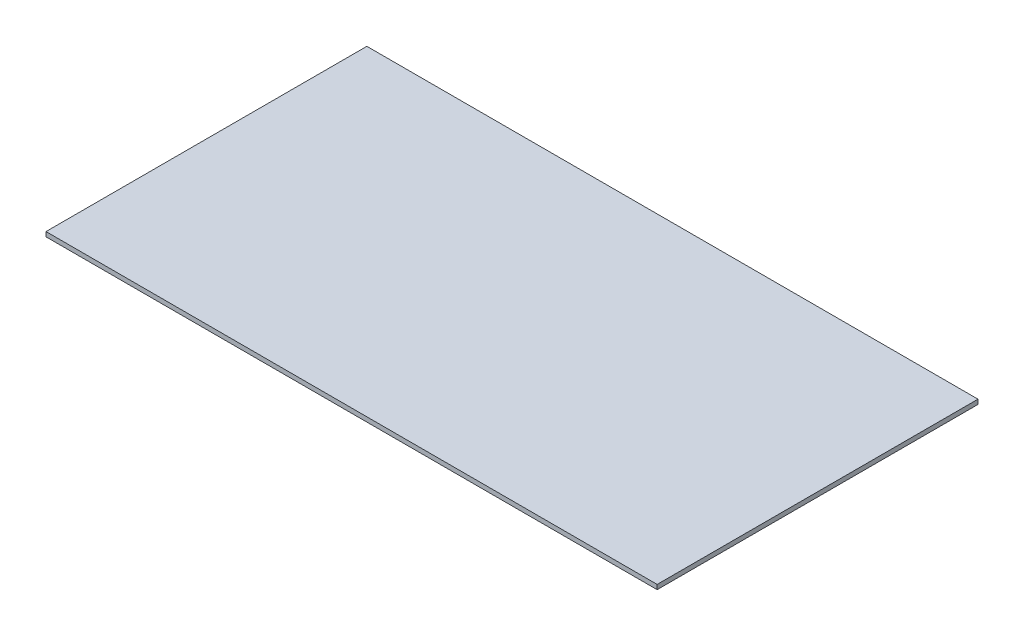
ISO-10303-21;
HEADER;
FILE_DESCRIPTION(('STEP AP214'),'2;1');
FILE_NAME('part.step','',(''),(''),'','','');
FILE_SCHEMA(('AUTOMOTIVE_DESIGN { 1 0 10303 214 1 1 1 1 }'));
ENDSEC;
DATA;
#1=APPLICATION_CONTEXT('core data for automotive mechanical design processes');
#2=APPLICATION_PROTOCOL_DEFINITION('international standard','automotive_design',2000,#1);
#3=PRODUCT_CONTEXT('',#1,'mechanical');
#4=PRODUCT('Part','Part','',(#3));
#5=PRODUCT_RELATED_PRODUCT_CATEGORY('part','',(#4));
#6=PRODUCT_DEFINITION_FORMATION('','',#4);
#7=PRODUCT_DEFINITION_CONTEXT('part definition',#1,'design');
#8=PRODUCT_DEFINITION('design','',#6,#7);
#9=PRODUCT_DEFINITION_SHAPE('','',#8);
#10=(LENGTH_UNIT() NAMED_UNIT(*) SI_UNIT(.MILLI.,.METRE.));
#11=(NAMED_UNIT(*) PLANE_ANGLE_UNIT() SI_UNIT($,.RADIAN.));
#12=(NAMED_UNIT(*) SI_UNIT($,.STERADIAN.) SOLID_ANGLE_UNIT());
#13=UNCERTAINTY_MEASURE_WITH_UNIT(LENGTH_MEASURE(1.E-05),#10,'distance_accuracy_value','');
#14=(GEOMETRIC_REPRESENTATION_CONTEXT(3) GLOBAL_UNCERTAINTY_ASSIGNED_CONTEXT((#13)) GLOBAL_UNIT_ASSIGNED_CONTEXT((#10,
#11,#12)) REPRESENTATION_CONTEXT('',''));
#15=CARTESIAN_POINT('',(0.,0.,0.));
#16=DIRECTION('',(0.,0.,1.));
#17=DIRECTION('',(1.,0.,0.));
#18=AXIS2_PLACEMENT_3D('',#15,#16,#17);
#19=CARTESIAN_POINT('',(0.,3.,0.));
#20=DIRECTION('',(1.,0.,0.));
#21=DIRECTION('',(0.,0.,-1.));
#22=AXIS2_PLACEMENT_3D('',#19,#20,#21);
#23=PLANE('',#22);
#24=DIRECTION('',(0.,0.,1.));
#25=VECTOR('',#24,1.);
#26=CARTESIAN_POINT('',(0.,0.,0.));
#27=LINE('',#26,#25);
#28=CARTESIAN_POINT('',(0.,0.,0.));
#29=VERTEX_POINT('',#28);
#30=CARTESIAN_POINT('',(0.,0.,210.));
#31=VERTEX_POINT('',#30);
#32=EDGE_CURVE('E96',#29,#31,#27,.T.);
#33=ORIENTED_EDGE('',*,*,#32,.T.);
#34=DIRECTION('',(0.,-1.,0.));
#35=VECTOR('',#34,1.);
#36=CARTESIAN_POINT('',(0.,3.,210.));
#37=LINE('',#36,#35);
#38=CARTESIAN_POINT('',(0.,3.,210.));
#39=VERTEX_POINT('',#38);
#40=EDGE_CURVE('E11',#39,#31,#37,.T.);
#41=ORIENTED_EDGE('',*,*,#40,.F.);
#42=DIRECTION('',(0.,0.,1.));
#43=VECTOR('',#42,1.);
#44=CARTESIAN_POINT('',(0.,3.,0.));
#45=LINE('',#44,#43);
#46=CARTESIAN_POINT('',(0.,3.,0.));
#47=VERTEX_POINT('',#46);
#48=EDGE_CURVE('E84',#47,#39,#45,.T.);
#49=ORIENTED_EDGE('',*,*,#48,.F.);
#50=DIRECTION('',(0.,-1.,0.));
#51=VECTOR('',#50,1.);
#52=CARTESIAN_POINT('',(0.,3.,0.));
#53=LINE('',#52,#51);
#54=EDGE_CURVE('E92',#47,#29,#53,.T.);
#55=ORIENTED_EDGE('',*,*,#54,.T.);
#56=EDGE_LOOP('',(#33,#41,#49,#55));
#57=FACE_BOUND('',#56,.T.);
#58=ADVANCED_FACE('F33',(#57),#23,.F.);
#59=CARTESIAN_POINT('',(0.,3.,210.));
#60=DIRECTION('',(0.,0.,-1.));
#61=DIRECTION('',(-1.,0.,0.));
#62=AXIS2_PLACEMENT_3D('',#59,#60,#61);
#63=PLANE('',#62);
#64=DIRECTION('',(1.,0.,0.));
#65=VECTOR('',#64,1.);
#66=CARTESIAN_POINT('',(0.,0.,210.));
#67=LINE('',#66,#65);
#68=CARTESIAN_POINT('',(400.,0.,210.));
#69=VERTEX_POINT('',#68);
#70=EDGE_CURVE('E88',#31,#69,#67,.T.);
#71=ORIENTED_EDGE('',*,*,#70,.T.);
#72=DIRECTION('',(0.,-1.,0.));
#73=VECTOR('',#72,1.);
#74=CARTESIAN_POINT('',(400.,3.,210.));
#75=LINE('',#74,#73);
#76=CARTESIAN_POINT('',(400.,3.,210.));
#77=VERTEX_POINT('',#76);
#78=EDGE_CURVE('E41',#77,#69,#75,.T.);
#79=ORIENTED_EDGE('',*,*,#78,.F.);
#80=DIRECTION('',(1.,0.,0.));
#81=VECTOR('',#80,1.);
#82=CARTESIAN_POINT('',(0.,3.,210.));
#83=LINE('',#82,#81);
#84=EDGE_CURVE('E79',#39,#77,#83,.T.);
#85=ORIENTED_EDGE('',*,*,#84,.F.);
#86=ORIENTED_EDGE('',*,*,#40,.T.);
#87=EDGE_LOOP('',(#71,#79,#85,#86));
#88=FACE_BOUND('',#87,.T.);
#89=ADVANCED_FACE('F87',(#88),#63,.F.);
#90=CARTESIAN_POINT('',(400.,3.,0.));
#91=DIRECTION('',(-1.,0.,0.));
#92=DIRECTION('',(0.,0.,1.));
#93=AXIS2_PLACEMENT_3D('',#90,#91,#92);
#94=PLANE('',#93);
#95=DIRECTION('',(0.,0.,-1.));
#96=VECTOR('',#95,1.);
#97=CARTESIAN_POINT('',(400.,0.,0.));
#98=LINE('',#97,#96);
#99=CARTESIAN_POINT('',(400.,0.,0.));
#100=VERTEX_POINT('',#99);
#101=EDGE_CURVE('E66',#69,#100,#98,.T.);
#102=ORIENTED_EDGE('',*,*,#101,.T.);
#103=DIRECTION('',(0.,-1.,0.));
#104=VECTOR('',#103,1.);
#105=CARTESIAN_POINT('',(400.,3.,0.));
#106=LINE('',#105,#104);
#107=CARTESIAN_POINT('',(400.,3.,0.));
#108=VERTEX_POINT('',#107);
#109=EDGE_CURVE('E89',#108,#100,#106,.T.);
#110=ORIENTED_EDGE('',*,*,#109,.F.);
#111=DIRECTION('',(0.,0.,-1.));
#112=VECTOR('',#111,1.);
#113=CARTESIAN_POINT('',(400.,3.,0.));
#114=LINE('',#113,#112);
#115=EDGE_CURVE('E82',#77,#108,#114,.T.);
#116=ORIENTED_EDGE('',*,*,#115,.F.);
#117=ORIENTED_EDGE('',*,*,#78,.T.);
#118=EDGE_LOOP('',(#102,#110,#116,#117));
#119=FACE_BOUND('',#118,.T.);
#120=ADVANCED_FACE('F90',(#119),#94,.F.);
#121=CARTESIAN_POINT('',(0.,3.,0.));
#122=DIRECTION('',(0.,0.,1.));
#123=DIRECTION('',(1.,0.,0.));
#124=AXIS2_PLACEMENT_3D('',#121,#122,#123);
#125=PLANE('',#124);
#126=DIRECTION('',(-1.,0.,0.));
#127=VECTOR('',#126,1.);
#128=CARTESIAN_POINT('',(0.,0.,0.));
#129=LINE('',#128,#127);
#130=EDGE_CURVE('E72',#100,#29,#129,.T.);
#131=ORIENTED_EDGE('',*,*,#130,.T.);
#132=ORIENTED_EDGE('',*,*,#54,.F.);
#133=DIRECTION('',(-1.,0.,0.));
#134=VECTOR('',#133,1.);
#135=CARTESIAN_POINT('',(0.,3.,0.));
#136=LINE('',#135,#134);
#137=EDGE_CURVE('E49',#108,#47,#136,.T.);
#138=ORIENTED_EDGE('',*,*,#137,.F.);
#139=ORIENTED_EDGE('',*,*,#109,.T.);
#140=EDGE_LOOP('',(#131,#132,#138,#139));
#141=FACE_BOUND('',#140,.T.);
#142=ADVANCED_FACE('F103',(#141),#125,.F.);
#143=CARTESIAN_POINT('',(0.,3.,0.));
#144=DIRECTION('',(0.,1.,0.));
#145=DIRECTION('',(0.,0.,1.));
#146=AXIS2_PLACEMENT_3D('',#143,#144,#145);
#147=PLANE('',#146);
#148=ORIENTED_EDGE('',*,*,#48,.T.);
#149=ORIENTED_EDGE('',*,*,#84,.T.);
#150=ORIENTED_EDGE('',*,*,#115,.T.);
#151=ORIENTED_EDGE('',*,*,#137,.T.);
#152=EDGE_LOOP('',(#148,#149,#150,#151));
#153=FACE_BOUND('',#152,.T.);
#154=ADVANCED_FACE('F80',(#153),#147,.T.);
#155=CARTESIAN_POINT('',(0.,0.,0.));
#156=DIRECTION('',(0.,1.,0.));
#157=DIRECTION('',(0.,0.,1.));
#158=AXIS2_PLACEMENT_3D('',#155,#156,#157);
#159=PLANE('',#158);
#160=ORIENTED_EDGE('',*,*,#32,.F.);
#161=ORIENTED_EDGE('',*,*,#130,.F.);
#162=ORIENTED_EDGE('',*,*,#101,.F.);
#163=ORIENTED_EDGE('',*,*,#70,.F.);
#164=EDGE_LOOP('',(#160,#161,#162,#163));
#165=FACE_BOUND('',#164,.T.);
#166=ADVANCED_FACE('F106',(#165),#159,.F.);
#167=CLOSED_SHELL('',(#58,#89,#120,#142,#154,#166));
#168=MANIFOLD_SOLID_BREP('B2',#167);
#169=ADVANCED_BREP_SHAPE_REPRESENTATION('',(#18,#168),#14);
#170=SHAPE_DEFINITION_REPRESENTATION(#9,#169);
ENDSEC;
END-ISO-10303-21;
